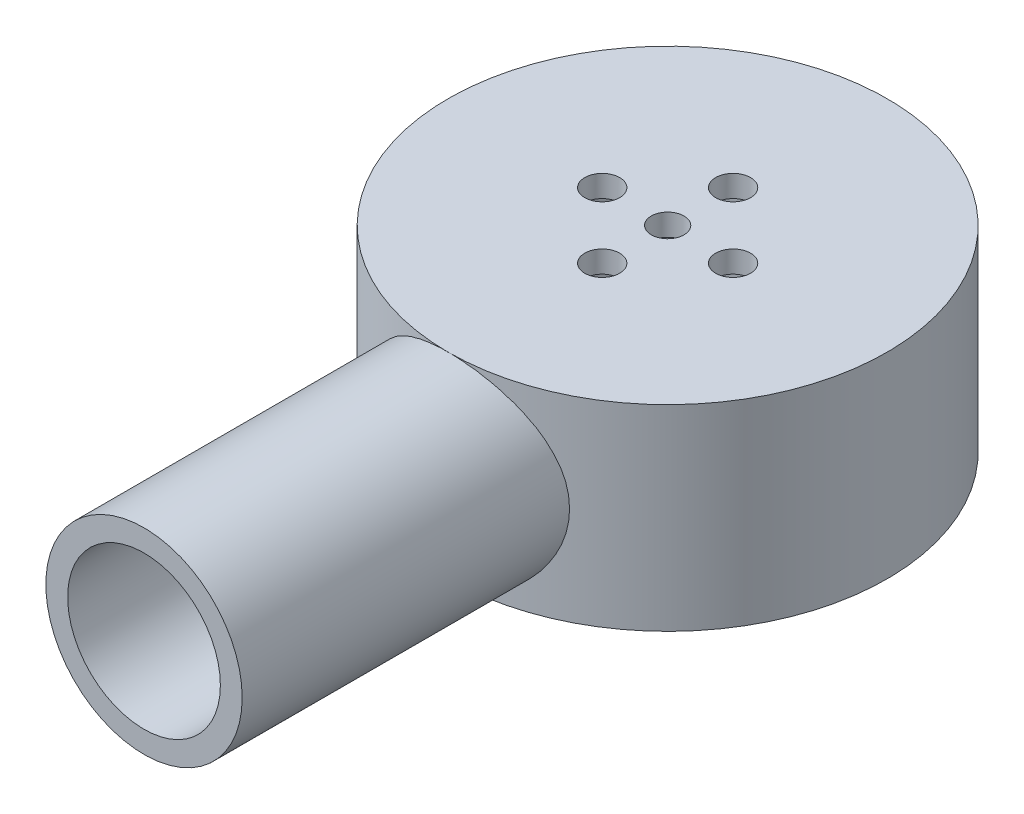
ISO-10303-21;
HEADER;
FILE_DESCRIPTION(('STEP AP214'),'2;1');
FILE_NAME('part.step','',(''),(''),'','','');
FILE_SCHEMA(('AUTOMOTIVE_DESIGN { 1 0 10303 214 1 1 1 1 }'));
ENDSEC;
DATA;
#1=APPLICATION_CONTEXT('core data for automotive mechanical design processes');
#2=APPLICATION_PROTOCOL_DEFINITION('international standard','automotive_design',2000,#1);
#3=PRODUCT_CONTEXT('',#1,'mechanical');
#4=PRODUCT('Part','Part','',(#3));
#5=PRODUCT_RELATED_PRODUCT_CATEGORY('part','',(#4));
#6=PRODUCT_DEFINITION_FORMATION('','',#4);
#7=PRODUCT_DEFINITION_CONTEXT('part definition',#1,'design');
#8=PRODUCT_DEFINITION('design','',#6,#7);
#9=PRODUCT_DEFINITION_SHAPE('','',#8);
#10=(LENGTH_UNIT() NAMED_UNIT(*) SI_UNIT(.MILLI.,.METRE.));
#11=(NAMED_UNIT(*) PLANE_ANGLE_UNIT() SI_UNIT($,.RADIAN.));
#12=(NAMED_UNIT(*) SI_UNIT($,.STERADIAN.) SOLID_ANGLE_UNIT());
#13=UNCERTAINTY_MEASURE_WITH_UNIT(LENGTH_MEASURE(1.E-05),#10,'distance_accuracy_value','');
#14=(GEOMETRIC_REPRESENTATION_CONTEXT(3) GLOBAL_UNCERTAINTY_ASSIGNED_CONTEXT((#13)) GLOBAL_UNIT_ASSIGNED_CONTEXT((#10,
#11,#12)) REPRESENTATION_CONTEXT('',''));
#15=CARTESIAN_POINT('',(0.,0.,0.));
#16=DIRECTION('',(0.,0.,1.));
#17=DIRECTION('',(1.,0.,0.));
#18=AXIS2_PLACEMENT_3D('',#15,#16,#17);
#19=CARTESIAN_POINT('',(0.,-9.,-54.));
#20=DIRECTION('',(0.,1.,0.));
#21=DIRECTION('',(0.,0.,1.));
#22=AXIS2_PLACEMENT_3D('',#19,#20,#21);
#23=CYLINDRICAL_SURFACE('',#22,1.6);
#24=CARTESIAN_POINT('',(0.,9.,-54.));
#25=DIRECTION('',(0.,1.,0.));
#26=DIRECTION('',(0.,0.,1.));
#27=AXIS2_PLACEMENT_3D('',#24,#25,#26);
#28=CIRCLE('',#27,1.6);
#29=CARTESIAN_POINT('',(0.,9.,-52.4));
#30=VERTEX_POINT('',#29);
#31=EDGE_CURVE('E69',#30,#30,#28,.T.);
#32=ORIENTED_EDGE('',*,*,#31,.T.);
#33=EDGE_LOOP('',(#32));
#34=FACE_BOUND('',#33,.T.);
#35=CARTESIAN_POINT('',(0.,7.,-54.));
#36=DIRECTION('',(0.,-1.,0.));
#37=DIRECTION('',(0.,0.,-1.));
#38=AXIS2_PLACEMENT_3D('',#35,#36,#37);
#39=CIRCLE('',#38,1.6);
#40=CARTESIAN_POINT('',(0.,7.,-55.6));
#41=VERTEX_POINT('',#40);
#42=EDGE_CURVE('E71',#41,#41,#39,.F.);
#43=ORIENTED_EDGE('',*,*,#42,.F.);
#44=EDGE_LOOP('',(#43));
#45=FACE_BOUND('',#44,.T.);
#46=ADVANCED_FACE('F54',(#34,#45),#23,.F.);
#47=CARTESIAN_POINT('',(6.,-9.,-48.));
#48=DIRECTION('',(0.,1.,0.));
#49=DIRECTION('',(0.,0.,1.));
#50=AXIS2_PLACEMENT_3D('',#47,#48,#49);
#51=CYLINDRICAL_SURFACE('',#50,1.6);
#52=CARTESIAN_POINT('',(6.,9.,-48.));
#53=DIRECTION('',(0.,1.,0.));
#54=DIRECTION('',(0.,0.,1.));
#55=AXIS2_PLACEMENT_3D('',#52,#53,#54);
#56=CIRCLE('',#55,1.6);
#57=CARTESIAN_POINT('',(6.,9.,-46.4));
#58=VERTEX_POINT('',#57);
#59=EDGE_CURVE('E87',#58,#58,#56,.T.);
#60=ORIENTED_EDGE('',*,*,#59,.T.);
#61=EDGE_LOOP('',(#60));
#62=FACE_BOUND('',#61,.T.);
#63=CARTESIAN_POINT('',(6.,7.,-48.));
#64=DIRECTION('',(0.,-1.,0.));
#65=DIRECTION('',(0.,0.,-1.));
#66=AXIS2_PLACEMENT_3D('',#63,#64,#65);
#67=CIRCLE('',#66,1.6);
#68=CARTESIAN_POINT('',(6.,7.,-49.6));
#69=VERTEX_POINT('',#68);
#70=EDGE_CURVE('E144',#69,#69,#67,.F.);
#71=ORIENTED_EDGE('',*,*,#70,.F.);
#72=EDGE_LOOP('',(#71));
#73=FACE_BOUND('',#72,.T.);
#74=ADVANCED_FACE('F118',(#62,#73),#51,.F.);
#75=CARTESIAN_POINT('',(-6.,-9.,-48.));
#76=DIRECTION('',(0.,1.,0.));
#77=DIRECTION('',(0.,0.,1.));
#78=AXIS2_PLACEMENT_3D('',#75,#76,#77);
#79=CYLINDRICAL_SURFACE('',#78,1.6);
#80=CARTESIAN_POINT('',(-6.,9.,-48.));
#81=DIRECTION('',(0.,1.,0.));
#82=DIRECTION('',(0.,0.,1.));
#83=AXIS2_PLACEMENT_3D('',#80,#81,#82);
#84=CIRCLE('',#83,1.6);
#85=CARTESIAN_POINT('',(-6.,9.,-46.4));
#86=VERTEX_POINT('',#85);
#87=EDGE_CURVE('E81',#86,#86,#84,.T.);
#88=ORIENTED_EDGE('',*,*,#87,.T.);
#89=EDGE_LOOP('',(#88));
#90=FACE_BOUND('',#89,.T.);
#91=CARTESIAN_POINT('',(-6.,7.,-48.));
#92=DIRECTION('',(0.,-1.,0.));
#93=DIRECTION('',(0.,0.,-1.));
#94=AXIS2_PLACEMENT_3D('',#91,#92,#93);
#95=CIRCLE('',#94,1.6);
#96=CARTESIAN_POINT('',(-6.,7.,-49.6));
#97=VERTEX_POINT('',#96);
#98=EDGE_CURVE('E139',#97,#97,#95,.F.);
#99=ORIENTED_EDGE('',*,*,#98,.F.);
#100=EDGE_LOOP('',(#99));
#101=FACE_BOUND('',#100,.T.);
#102=ADVANCED_FACE('F121',(#90,#101),#79,.F.);
#103=CARTESIAN_POINT('',(0.,-9.,-42.));
#104=DIRECTION('',(0.,1.,0.));
#105=DIRECTION('',(0.,0.,1.));
#106=AXIS2_PLACEMENT_3D('',#103,#104,#105);
#107=CYLINDRICAL_SURFACE('',#106,1.6);
#108=CARTESIAN_POINT('',(0.,9.,-42.));
#109=DIRECTION('',(0.,1.,0.));
#110=DIRECTION('',(0.,0.,1.));
#111=AXIS2_PLACEMENT_3D('',#108,#109,#110);
#112=CIRCLE('',#111,1.6);
#113=CARTESIAN_POINT('',(0.,9.,-40.4));
#114=VERTEX_POINT('',#113);
#115=EDGE_CURVE('E78',#114,#114,#112,.T.);
#116=ORIENTED_EDGE('',*,*,#115,.T.);
#117=EDGE_LOOP('',(#116));
#118=FACE_BOUND('',#117,.T.);
#119=CARTESIAN_POINT('',(0.,7.,-42.));
#120=DIRECTION('',(0.,-1.,0.));
#121=DIRECTION('',(0.,0.,-1.));
#122=AXIS2_PLACEMENT_3D('',#119,#120,#121);
#123=CIRCLE('',#122,1.6);
#124=CARTESIAN_POINT('',(0.,7.,-43.6));
#125=VERTEX_POINT('',#124);
#126=EDGE_CURVE('E140',#125,#125,#123,.F.);
#127=ORIENTED_EDGE('',*,*,#126,.F.);
#128=EDGE_LOOP('',(#127));
#129=FACE_BOUND('',#128,.T.);
#130=ADVANCED_FACE('F113',(#118,#129),#107,.F.);
#131=CARTESIAN_POINT('',(0.,-9.,-48.));
#132=DIRECTION('',(0.,1.,0.));
#133=DIRECTION('',(0.,0.,1.));
#134=AXIS2_PLACEMENT_3D('',#131,#132,#133);
#135=CYLINDRICAL_SURFACE('',#134,1.5);
#136=CARTESIAN_POINT('',(0.,9.,-48.));
#137=DIRECTION('',(0.,1.,0.));
#138=DIRECTION('',(0.,0.,1.));
#139=AXIS2_PLACEMENT_3D('',#136,#137,#138);
#140=CIRCLE('',#139,1.5);
#141=CARTESIAN_POINT('',(0.,9.,-46.5));
#142=VERTEX_POINT('',#141);
#143=EDGE_CURVE('E73',#142,#142,#140,.T.);
#144=ORIENTED_EDGE('',*,*,#143,.T.);
#145=EDGE_LOOP('',(#144));
#146=FACE_BOUND('',#145,.T.);
#147=CARTESIAN_POINT('',(0.,7.,-48.));
#148=DIRECTION('',(0.,-1.,0.));
#149=DIRECTION('',(0.,0.,-1.));
#150=AXIS2_PLACEMENT_3D('',#147,#148,#149);
#151=CIRCLE('',#150,1.5);
#152=CARTESIAN_POINT('',(0.,7.,-49.5));
#153=VERTEX_POINT('',#152);
#154=EDGE_CURVE('E56',#153,#153,#151,.F.);
#155=ORIENTED_EDGE('',*,*,#154,.F.);
#156=EDGE_LOOP('',(#155));
#157=FACE_BOUND('',#156,.T.);
#158=ADVANCED_FACE('F60',(#146,#157),#135,.F.);
#159=CARTESIAN_POINT('',(0.,-9.,-48.));
#160=DIRECTION('',(0.,1.,0.));
#161=DIRECTION('',(0.,0.,1.));
#162=AXIS2_PLACEMENT_3D('',#159,#160,#161);
#163=CYLINDRICAL_SURFACE('',#162,20.1246117974981);
#164=CARTESIAN_POINT('',(0.,-9.,-48.));
#165=DIRECTION('',(0.,1.,0.));
#166=DIRECTION('',(0.,0.,1.));
#167=AXIS2_PLACEMENT_3D('',#164,#165,#166);
#168=CIRCLE('',#167,20.1246117974981);
#169=CARTESIAN_POINT('',(0.,-9.,-27.8753882025019));
#170=VERTEX_POINT('',#169);
#171=EDGE_CURVE('E11',#170,#170,#168,.T.);
#172=ORIENTED_EDGE('',*,*,#171,.T.);
#173=EDGE_LOOP('',(#172));
#174=FACE_BOUND('',#173,.T.);
#175=CARTESIAN_POINT('',(0.,9.,-48.));
#176=DIRECTION('',(0.,1.,0.));
#177=DIRECTION('',(0.,0.,1.));
#178=AXIS2_PLACEMENT_3D('',#175,#176,#177);
#179=CIRCLE('',#178,20.1246117974981);
#180=CARTESIAN_POINT('',(0.,9.,-27.8753882025019));
#181=VERTEX_POINT('',#180);
#182=EDGE_CURVE('E63',#181,#181,#179,.T.);
#183=ORIENTED_EDGE('',*,*,#182,.F.);
#184=EDGE_LOOP('',(#183));
#185=FACE_BOUND('',#184,.T.);
#186=ADVANCED_FACE('F106',(#174,#185),#163,.T.);
#187=CARTESIAN_POINT('',(0.,-9.,0.));
#188=DIRECTION('',(0.,1.,0.));
#189=DIRECTION('',(0.,0.,1.));
#190=AXIS2_PLACEMENT_3D('',#187,#188,#189);
#191=PLANE('',#190);
#192=CARTESIAN_POINT('',(0.,-9.,-48.));
#193=DIRECTION('',(0.,-1.,0.));
#194=DIRECTION('',(0.,0.,-1.));
#195=AXIS2_PLACEMENT_3D('',#192,#193,#194);
#196=CIRCLE('',#195,18.1246117974981);
#197=CARTESIAN_POINT('',(0.,-9.,-66.1246117974981));
#198=VERTEX_POINT('',#197);
#199=EDGE_CURVE('E147',#198,#198,#196,.T.);
#200=ORIENTED_EDGE('',*,*,#199,.F.);
#201=EDGE_LOOP('',(#200));
#202=FACE_BOUND('',#201,.T.);
#203=ORIENTED_EDGE('',*,*,#171,.F.);
#204=EDGE_LOOP('',(#203));
#205=FACE_BOUND('',#204,.T.);
#206=ADVANCED_FACE('F101',(#202,#205),#191,.F.);
#207=CARTESIAN_POINT('',(0.,9.,0.));
#208=DIRECTION('',(0.,1.,0.));
#209=DIRECTION('',(0.,0.,1.));
#210=AXIS2_PLACEMENT_3D('',#207,#208,#209);
#211=PLANE('',#210);
#212=ORIENTED_EDGE('',*,*,#143,.F.);
#213=EDGE_LOOP('',(#212));
#214=FACE_BOUND('',#213,.T.);
#215=ORIENTED_EDGE('',*,*,#115,.F.);
#216=EDGE_LOOP('',(#215));
#217=FACE_BOUND('',#216,.T.);
#218=ORIENTED_EDGE('',*,*,#87,.F.);
#219=EDGE_LOOP('',(#218));
#220=FACE_BOUND('',#219,.T.);
#221=ORIENTED_EDGE('',*,*,#59,.F.);
#222=EDGE_LOOP('',(#221));
#223=FACE_BOUND('',#222,.T.);
#224=ORIENTED_EDGE('',*,*,#31,.F.);
#225=EDGE_LOOP('',(#224));
#226=FACE_BOUND('',#225,.T.);
#227=ORIENTED_EDGE('',*,*,#182,.T.);
#228=EDGE_LOOP('',(#227));
#229=FACE_BOUND('',#228,.T.);
#230=ADVANCED_FACE('F100',(#214,#217,#220,#223,#226,#229),#211,.T.);
#231=CARTESIAN_POINT('',(0.,7.,-48.));
#232=DIRECTION('',(0.,-1.,0.));
#233=DIRECTION('',(0.,0.,-1.));
#234=AXIS2_PLACEMENT_3D('',#231,#232,#233);
#235=PLANE('',#234);
#236=CARTESIAN_POINT('',(0.,7.,-48.));
#237=DIRECTION('',(0.,-1.,0.));
#238=DIRECTION('',(0.,0.,-1.));
#239=AXIS2_PLACEMENT_3D('',#236,#237,#238);
#240=CIRCLE('',#239,18.1246117974981);
#241=CARTESIAN_POINT('',(0.,7.,-66.1246117974981));
#242=VERTEX_POINT('',#241);
#243=EDGE_CURVE('E146',#242,#242,#240,.T.);
#244=ORIENTED_EDGE('',*,*,#243,.T.);
#245=EDGE_LOOP('',(#244));
#246=FACE_BOUND('',#245,.T.);
#247=ORIENTED_EDGE('',*,*,#154,.T.);
#248=EDGE_LOOP('',(#247));
#249=FACE_BOUND('',#248,.T.);
#250=ORIENTED_EDGE('',*,*,#126,.T.);
#251=EDGE_LOOP('',(#250));
#252=FACE_BOUND('',#251,.T.);
#253=ORIENTED_EDGE('',*,*,#98,.T.);
#254=EDGE_LOOP('',(#253));
#255=FACE_BOUND('',#254,.T.);
#256=ORIENTED_EDGE('',*,*,#70,.T.);
#257=EDGE_LOOP('',(#256));
#258=FACE_BOUND('',#257,.T.);
#259=ORIENTED_EDGE('',*,*,#42,.T.);
#260=EDGE_LOOP('',(#259));
#261=FACE_BOUND('',#260,.T.);
#262=ADVANCED_FACE('F99',(#246,#249,#252,#255,#258,#261),#235,.T.);
#263=CARTESIAN_POINT('',(0.,7.,-48.));
#264=DIRECTION('',(0.,-1.,0.));
#265=DIRECTION('',(0.,0.,-1.));
#266=AXIS2_PLACEMENT_3D('',#263,#264,#265);
#267=CYLINDRICAL_SURFACE('',#266,18.1246117974981);
#268=ORIENTED_EDGE('',*,*,#243,.F.);
#269=EDGE_LOOP('',(#268));
#270=FACE_BOUND('',#269,.T.);
#271=ORIENTED_EDGE('',*,*,#199,.T.);
#272=EDGE_LOOP('',(#271));
#273=FACE_BOUND('',#272,.T.);
#274=ADVANCED_FACE('F161',(#270,#273),#267,.F.);
#275=CLOSED_SHELL('',(#46,#74,#102,#130,#158,#186,#206,#230,#262,#274));
#276=MANIFOLD_SOLID_BREP('B2',#275);
#277=CARTESIAN_POINT('',(0.,0.,-30.));
#278=DIRECTION('',(0.,0.,1.));
#279=DIRECTION('',(1.,0.,0.));
#280=AXIS2_PLACEMENT_3D('',#277,#278,#279);
#281=CYLINDRICAL_SURFACE('',#280,7.);
#282=CARTESIAN_POINT('',(0.,0.,-30.));
#283=DIRECTION('',(0.,0.,1.));
#284=DIRECTION('',(1.,0.,0.));
#285=AXIS2_PLACEMENT_3D('',#282,#283,#284);
#286=CIRCLE('',#285,7.);
#287=CARTESIAN_POINT('',(-2.12168631281994,6.67071564301706,-30.));
#288=VERTEX_POINT('',#287);
#289=CARTESIAN_POINT('',(-2.12168631281994,-6.67071564301706,-30.));
#290=VERTEX_POINT('',#289);
#291=EDGE_CURVE('E320',#288,#290,#286,.T.);
#292=ORIENTED_EDGE('',*,*,#291,.F.);
#293=CARTESIAN_POINT('',(-2.12168631281994,6.67071564301706,-30.));
#294=CARTESIAN_POINT('',(-1.94385592258952,6.72730249886766,-29.9790138519642));
#295=CARTESIAN_POINT('',(-1.76347277614036,6.77681883570064,-29.9604477763236));
#296=CARTESIAN_POINT('',(-1.39886483798211,6.86134895882386,-29.9285313021066));
#297=CARTESIAN_POINT('',(-1.2146395530181,6.89636087084325,-29.9151815776031));
#298=CARTESIAN_POINT('',(-0.848669059565637,6.95076092061708,-29.8943640107143));
#299=CARTESIAN_POINT('',(-0.666991309733222,6.97054559806225,-29.8867470062315));
#300=CARTESIAN_POINT('',(-0.302522695528774,6.99584415008689,-29.8769969255578));
#301=CARTESIAN_POINT('',(-0.119732011968208,7.00136028388192,-29.8748629812046));
#302=CARTESIAN_POINT('',(0.235486413791838,6.99816487038001,-29.8760968206361));
#303=CARTESIAN_POINT('',(0.407922766776372,6.99023072581739,-29.8791639919379));
#304=CARTESIAN_POINT('',(0.751595981063137,6.96166936965116,-29.890162159583));
#305=CARTESIAN_POINT('',(0.922832768418051,6.9410413823786,-29.8980934531529));
#306=CARTESIAN_POINT('',(1.26750004266833,6.88655644404256,-29.918917851842));
#307=CARTESIAN_POINT('',(1.44087036489305,6.8523668823638,-29.9319355762999));
#308=CARTESIAN_POINT('',(1.78414394684365,6.77111588386591,-29.9625870842216));
#309=CARTESIAN_POINT('',(1.95404739541604,6.72405515018363,-29.9802206155269));
#310=CARTESIAN_POINT('',(2.12168631281994,6.67071564301706,-30.));
#311=B_SPLINE_CURVE_WITH_KNOTS('',3,(#293,#294,#295,#296,#297,#298,#299,#300,#301,#302,#303,
#304,#305,#306,#307,#308,#309,#310),.UNSPECIFIED.,.F.,.F.,(4,2,2,2,2,2,2,2,4),(0.,
0.563240686963649,1.12655413355562,1.67464903235527,2.22265714301574,2.74005929081363,
3.25749305808632,3.78849090104356,4.31945974201081),.UNSPECIFIED.);
#312=CARTESIAN_POINT('',(0.,7.,-29.8753882025019));
#313=VERTEX_POINT('',#312);
#314=EDGE_CURVE('E331',#288,#313,#311,.T.);
#315=ORIENTED_EDGE('',*,*,#314,.T.);
#316=CARTESIAN_POINT('',(2.12168631281994,6.67071564301706,-30.));
#317=VERTEX_POINT('',#316);
#318=EDGE_CURVE('E304',#313,#317,#311,.T.);
#319=ORIENTED_EDGE('',*,*,#318,.T.);
#320=CARTESIAN_POINT('',(2.12168631281994,-6.67071564301706,-30.));
#321=VERTEX_POINT('',#320);
#322=EDGE_CURVE('E313',#321,#317,#286,.T.);
#323=ORIENTED_EDGE('',*,*,#322,.F.);
#324=CARTESIAN_POINT('',(2.12168631281994,-6.67071564301706,-30.));
#325=CARTESIAN_POINT('',(1.94385592258952,-6.72730249886766,-29.9790138519642));
#326=CARTESIAN_POINT('',(1.76347277614036,-6.77681883570064,-29.9604477763236));
#327=CARTESIAN_POINT('',(1.39886483798211,-6.86134895882386,-29.9285313021066));
#328=CARTESIAN_POINT('',(1.21463955301811,-6.89636087084325,-29.9151815776031));
#329=CARTESIAN_POINT('',(0.84866905956564,-6.95076092061708,-29.8943640107143));
#330=CARTESIAN_POINT('',(0.666991309733224,-6.97054559806225,-29.8867470062315));
#331=CARTESIAN_POINT('',(0.302522695528777,-6.99584415008689,-29.8769969255578));
#332=CARTESIAN_POINT('',(0.11973201196821,-7.00136028388192,-29.8748629812046));
#333=CARTESIAN_POINT('',(-0.235486413791836,-6.99816487038,-29.8760968206361));
#334=CARTESIAN_POINT('',(-0.40792276677637,-6.99023072581739,-29.8791639919379));
#335=CARTESIAN_POINT('',(-0.751595981063135,-6.96166936965116,-29.890162159583));
#336=CARTESIAN_POINT('',(-0.922832768418049,-6.9410413823786,-29.8980934531529));
#337=CARTESIAN_POINT('',(-1.26750004266833,-6.88655644404256,-29.918917851842));
#338=CARTESIAN_POINT('',(-1.44087036489305,-6.8523668823638,-29.9319355762999));
#339=CARTESIAN_POINT('',(-1.78414394684364,-6.77111588386591,-29.9625870842216));
#340=CARTESIAN_POINT('',(-1.95404739541604,-6.72405515018363,-29.9802206155269));
#341=CARTESIAN_POINT('',(-2.12168631281994,-6.67071564301706,-30.));
#342=B_SPLINE_CURVE_WITH_KNOTS('',3,(#324,#325,#326,#327,#328,#329,#330,#331,#332,#333,#334,
#335,#336,#337,#338,#339,#340,#341),.UNSPECIFIED.,.F.,.F.,(4,2,2,2,2,2,2,2,4),(0.,
0.563240686963648,1.12655413355562,1.67464903235527,2.22265714301574,2.74005929081363,
3.25749305808632,3.78849090104357,4.31945974201082),.UNSPECIFIED.);
#343=EDGE_CURVE('E261',#321,#290,#342,.T.);
#344=ORIENTED_EDGE('',*,*,#343,.T.);
#345=EDGE_LOOP('',(#292,#315,#319,#323,#344));
#346=FACE_BOUND('',#345,.T.);
#347=CARTESIAN_POINT('',(0.,0.,0.));
#348=DIRECTION('',(0.,0.,1.));
#349=DIRECTION('',(1.,0.,0.));
#350=AXIS2_PLACEMENT_3D('',#347,#348,#349);
#351=CIRCLE('',#350,7.);
#352=CARTESIAN_POINT('',(7.,0.,0.));
#353=VERTEX_POINT('',#352);
#354=EDGE_CURVE('E321',#353,#353,#351,.T.);
#355=ORIENTED_EDGE('',*,*,#354,.T.);
#356=EDGE_LOOP('',(#355));
#357=FACE_BOUND('',#356,.T.);
#358=ADVANCED_FACE('F242',(#346,#357),#281,.F.);
#359=CARTESIAN_POINT('',(0.,0.,-30.));
#360=DIRECTION('',(0.,0.,1.));
#361=DIRECTION('',(1.,0.,0.));
#362=AXIS2_PLACEMENT_3D('',#359,#360,#361);
#363=CYLINDRICAL_SURFACE('',#362,9.);
#364=CARTESIAN_POINT('',(2.12168631281994,-8.74633907357773,-30.));
#365=CARTESIAN_POINT('',(1.89814505751387,-8.80060125988988,-29.9736134505161));
#366=CARTESIAN_POINT('',(1.67204370166174,-8.84633941277044,-29.9512208363938));
#367=CARTESIAN_POINT('',(1.21626077648949,-8.92041879264643,-29.9148074993664));
#368=CARTESIAN_POINT('',(0.986577920069315,-8.94875361035249,-29.9007898608438));
#369=CARTESIAN_POINT('',(0.530379774553793,-8.98721202760524,-29.8817409799365));
#370=CARTESIAN_POINT('',(0.303904983911977,-8.99772014806186,-29.8765200112819));
#371=CARTESIAN_POINT('',(-0.149112246052221,-9.00161426220444,-29.8745868958163));
#372=CARTESIAN_POINT('',(-0.375654611891754,-8.99500777937714,-29.8778710102168));
#373=CARTESIAN_POINT('',(-0.856618679891554,-8.96278583019742,-29.8938450664275));
#374=CARTESIAN_POINT('',(-1.11085259762887,-8.93482006235967,-29.9076977057969));
#375=CARTESIAN_POINT('',(-1.49066676008326,-8.87663382531876,-29.9363374165007));
#376=CARTESIAN_POINT('',(-1.61781628153491,-8.85433802300771,-29.9472890919476));
#377=CARTESIAN_POINT('',(-1.87079590065578,-8.80435912721082,-29.9717492207284));
#378=CARTESIAN_POINT('',(-1.99662608100258,-8.77667637345489,-29.9852575128269));
#379=CARTESIAN_POINT('',(-2.12168631281994,-8.74633907357773,-30.));
#380=B_SPLINE_CURVE_WITH_KNOTS('',3,(#364,#365,#366,#367,#368,#369,#370,#371,#372,#373,#374,
#375,#376,#377,#378,#379),.UNSPECIFIED.,.F.,.F.,(4,2,2,2,2,2,2,4),(0.,0.694449680036767,
1.38915495845656,2.06867546342849,2.74789730556803,3.5150560139899,3.9035929753357,
4.29210544140349),.UNSPECIFIED.);
#381=CARTESIAN_POINT('',(2.12168631281994,-8.74633907357773,-30.));
#382=VERTEX_POINT('',#381);
#383=CARTESIAN_POINT('',(-2.12168631281994,-8.74633907357773,-30.));
#384=VERTEX_POINT('',#383);
#385=EDGE_CURVE('E266',#382,#384,#380,.T.);
#386=ORIENTED_EDGE('',*,*,#385,.F.);
#387=CARTESIAN_POINT('',(0.,0.,-30.));
#388=DIRECTION('',(0.,0.,1.));
#389=DIRECTION('',(1.,0.,0.));
#390=AXIS2_PLACEMENT_3D('',#387,#388,#389);
#391=CIRCLE('',#390,9.);
#392=EDGE_CURVE('E297',#382,#384,#391,.T.);
#393=ORIENTED_EDGE('',*,*,#392,.T.);
#394=EDGE_LOOP('',(#386,#393));
#395=FACE_BOUND('',#394,.T.);
#396=CARTESIAN_POINT('',(0.,0.,0.));
#397=DIRECTION('',(0.,0.,1.));
#398=DIRECTION('',(1.,0.,0.));
#399=AXIS2_PLACEMENT_3D('',#396,#397,#398);
#400=CIRCLE('',#399,9.);
#401=CARTESIAN_POINT('',(9.,0.,0.));
#402=VERTEX_POINT('',#401);
#403=EDGE_CURVE('E318',#402,#402,#400,.T.);
#404=ORIENTED_EDGE('',*,*,#403,.F.);
#405=EDGE_LOOP('',(#404));
#406=FACE_BOUND('',#405,.T.);
#407=ADVANCED_FACE('F342',(#395,#406),#363,.T.);
#408=CARTESIAN_POINT('',(0.,0.,-30.));
#409=DIRECTION('',(0.,0.,1.));
#410=DIRECTION('',(1.,0.,0.));
#411=AXIS2_PLACEMENT_3D('',#408,#409,#410);
#412=PLANE('',#411);
#413=ORIENTED_EDGE('',*,*,#291,.T.);
#414=DIRECTION('',(0.,-1.,0.));
#415=VECTOR('',#414,1.);
#416=CARTESIAN_POINT('',(-2.12168631281994,7.,-30.));
#417=LINE('',#416,#415);
#418=EDGE_CURVE('E52',#290,#384,#417,.T.);
#419=ORIENTED_EDGE('',*,*,#418,.T.);
#420=ORIENTED_EDGE('',*,*,#392,.F.);
#421=DIRECTION('',(0.,-1.,0.));
#422=VECTOR('',#421,1.);
#423=CARTESIAN_POINT('',(2.12168631281994,7.,-30.));
#424=LINE('',#423,#422);
#425=EDGE_CURVE('E255',#382,#321,#424,.F.);
#426=ORIENTED_EDGE('',*,*,#425,.T.);
#427=ORIENTED_EDGE('',*,*,#322,.T.);
#428=CARTESIAN_POINT('',(2.12168631281994,7.,-30.));
#429=VERTEX_POINT('',#428);
#430=EDGE_CURVE('E298',#317,#429,#424,.F.);
#431=ORIENTED_EDGE('',*,*,#430,.T.);
#432=DIRECTION('',(1.,0.,0.));
#433=VECTOR('',#432,1.);
#434=CARTESIAN_POINT('',(0.,7.,-30.));
#435=LINE('',#434,#433);
#436=CARTESIAN_POINT('',(-2.12168631281994,7.,-30.));
#437=VERTEX_POINT('',#436);
#438=EDGE_CURVE('E286',#437,#429,#435,.T.);
#439=ORIENTED_EDGE('',*,*,#438,.F.);
#440=EDGE_CURVE('E247',#437,#288,#417,.T.);
#441=ORIENTED_EDGE('',*,*,#440,.T.);
#442=EDGE_LOOP('',(#413,#419,#420,#426,#427,#431,#439,#441));
#443=FACE_BOUND('',#442,.T.);
#444=ADVANCED_FACE('F310',(#443),#412,.F.);
#445=CARTESIAN_POINT('',(0.,0.,0.));
#446=DIRECTION('',(0.,0.,1.));
#447=DIRECTION('',(1.,0.,0.));
#448=AXIS2_PLACEMENT_3D('',#445,#446,#447);
#449=PLANE('',#448);
#450=ORIENTED_EDGE('',*,*,#354,.F.);
#451=EDGE_LOOP('',(#450));
#452=FACE_BOUND('',#451,.T.);
#453=ORIENTED_EDGE('',*,*,#403,.T.);
#454=EDGE_LOOP('',(#453));
#455=FACE_BOUND('',#454,.T.);
#456=ADVANCED_FACE('F358',(#452,#455),#449,.T.);
#457=CARTESIAN_POINT('',(0.,7.,-48.));
#458=DIRECTION('',(0.,-1.,0.));
#459=DIRECTION('',(0.,0.,-1.));
#460=AXIS2_PLACEMENT_3D('',#457,#458,#459);
#461=PLANE('',#460);
#462=CARTESIAN_POINT('',(0.,7.,-48.));
#463=DIRECTION('',(0.,-1.,0.));
#464=DIRECTION('',(0.,0.,-1.));
#465=AXIS2_PLACEMENT_3D('',#462,#463,#464);
#466=CIRCLE('',#465,18.1246117974981);
#467=EDGE_CURVE('E292',#429,#313,#466,.T.);
#468=ORIENTED_EDGE('',*,*,#467,.T.);
#469=EDGE_CURVE('E294',#313,#437,#466,.T.);
#470=ORIENTED_EDGE('',*,*,#469,.T.);
#471=ORIENTED_EDGE('',*,*,#438,.T.);
#472=EDGE_LOOP('',(#468,#470,#471));
#473=FACE_BOUND('',#472,.T.);
#474=ADVANCED_FACE('F289',(#473),#461,.T.);
#475=CARTESIAN_POINT('',(0.,7.,-48.));
#476=DIRECTION('',(0.,-1.,0.));
#477=DIRECTION('',(0.,0.,-1.));
#478=AXIS2_PLACEMENT_3D('',#475,#476,#477);
#479=CYLINDRICAL_SURFACE('',#478,18.1246117974981);
#480=ORIENTED_EDGE('',*,*,#467,.F.);
#481=ORIENTED_EDGE('',*,*,#430,.F.);
#482=ORIENTED_EDGE('',*,*,#318,.F.);
#483=EDGE_LOOP('',(#480,#481,#482));
#484=FACE_BOUND('',#483,.T.);
#485=ADVANCED_FACE('F301',(#484),#479,.F.);
#486=ORIENTED_EDGE('',*,*,#469,.F.);
#487=ORIENTED_EDGE('',*,*,#314,.F.);
#488=ORIENTED_EDGE('',*,*,#440,.F.);
#489=EDGE_LOOP('',(#486,#487,#488));
#490=FACE_BOUND('',#489,.T.);
#491=ADVANCED_FACE('F351',(#490),#479,.F.);
#492=ORIENTED_EDGE('',*,*,#385,.T.);
#493=ORIENTED_EDGE('',*,*,#418,.F.);
#494=ORIENTED_EDGE('',*,*,#343,.F.);
#495=ORIENTED_EDGE('',*,*,#425,.F.);
#496=EDGE_LOOP('',(#492,#493,#494,#495));
#497=FACE_BOUND('',#496,.T.);
#498=ADVANCED_FACE('F350',(#497),#479,.F.);
#499=CLOSED_SHELL('',(#358,#407,#444,#456,#474,#485,#491,#498));
#500=MANIFOLD_SOLID_BREP('B6',#499);
#501=ADVANCED_BREP_SHAPE_REPRESENTATION('',(#18,#276,#500),#14);
#502=SHAPE_DEFINITION_REPRESENTATION(#9,#501);
ENDSEC;
END-ISO-10303-21;
